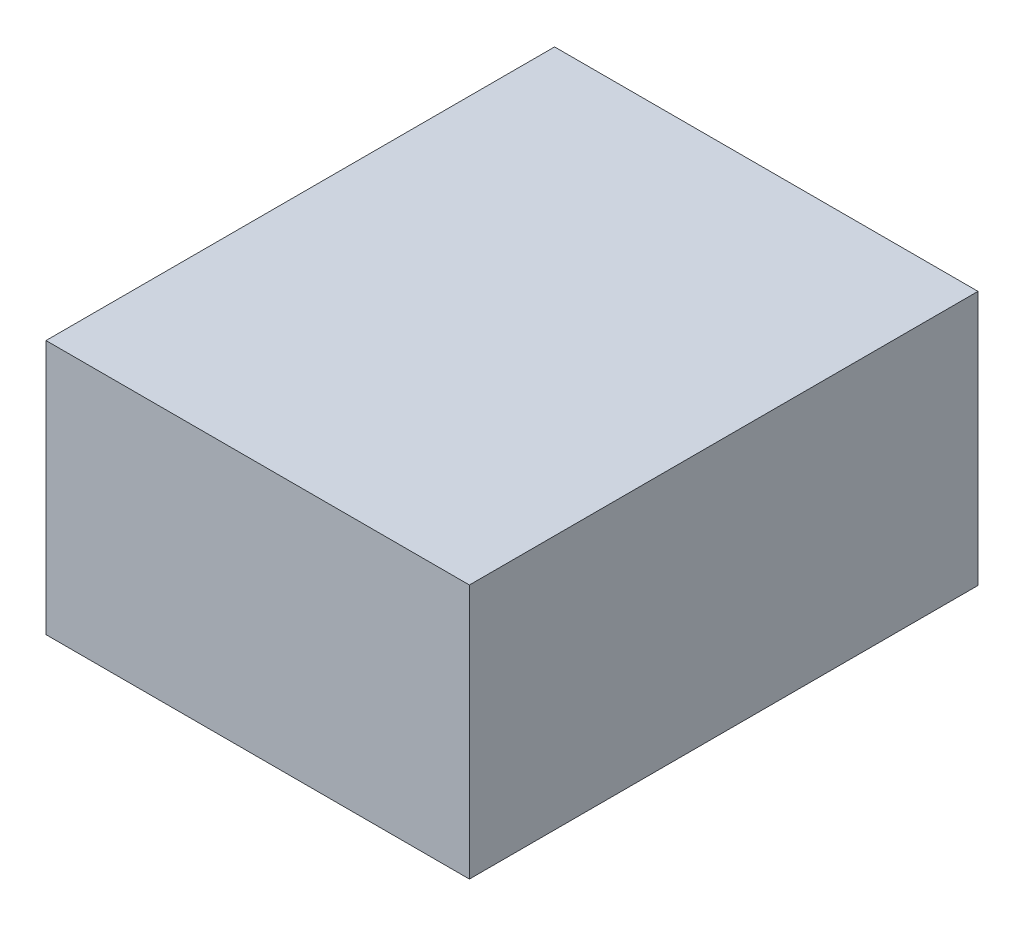
ISO-10303-21;
HEADER;
FILE_DESCRIPTION(('STEP AP214'),'2;1');
FILE_NAME('part.step','',(''),(''),'','','');
FILE_SCHEMA(('AUTOMOTIVE_DESIGN { 1 0 10303 214 1 1 1 1 }'));
ENDSEC;
DATA;
#1=APPLICATION_CONTEXT('core data for automotive mechanical design processes');
#2=APPLICATION_PROTOCOL_DEFINITION('international standard','automotive_design',2000,#1);
#3=PRODUCT_CONTEXT('',#1,'mechanical');
#4=PRODUCT('Part','Part','',(#3));
#5=PRODUCT_RELATED_PRODUCT_CATEGORY('part','',(#4));
#6=PRODUCT_DEFINITION_FORMATION('','',#4);
#7=PRODUCT_DEFINITION_CONTEXT('part definition',#1,'design');
#8=PRODUCT_DEFINITION('design','',#6,#7);
#9=PRODUCT_DEFINITION_SHAPE('','',#8);
#10=(LENGTH_UNIT() NAMED_UNIT(*) SI_UNIT(.MILLI.,.METRE.));
#11=(NAMED_UNIT(*) PLANE_ANGLE_UNIT() SI_UNIT($,.RADIAN.));
#12=(NAMED_UNIT(*) SI_UNIT($,.STERADIAN.) SOLID_ANGLE_UNIT());
#13=UNCERTAINTY_MEASURE_WITH_UNIT(LENGTH_MEASURE(1.E-05),#10,'distance_accuracy_value','');
#14=(GEOMETRIC_REPRESENTATION_CONTEXT(3) GLOBAL_UNCERTAINTY_ASSIGNED_CONTEXT((#13)) GLOBAL_UNIT_ASSIGNED_CONTEXT((#10,
#11,#12)) REPRESENTATION_CONTEXT('',''));
#15=CARTESIAN_POINT('',(0.,0.,0.));
#16=DIRECTION('',(0.,0.,1.));
#17=DIRECTION('',(1.,0.,0.));
#18=AXIS2_PLACEMENT_3D('',#15,#16,#17);
#19=CARTESIAN_POINT('',(12.48749852,7.51249958,0.));
#20=DIRECTION('',(0.,-1.,0.));
#21=DIRECTION('',(0.,0.,-1.));
#22=AXIS2_PLACEMENT_3D('',#19,#20,#21);
#23=PLANE('',#22);
#24=DIRECTION('',(0.,0.,-1.));
#25=VECTOR('',#24,1.);
#26=CARTESIAN_POINT('',(-12.48750106,7.51249958,0.));
#27=LINE('',#26,#25);
#28=CARTESIAN_POINT('',(-12.48750106,7.51249958,0.));
#29=VERTEX_POINT('',#28);
#30=CARTESIAN_POINT('',(-12.48750106,7.51249958,30.00000096));
#31=VERTEX_POINT('',#30);
#32=EDGE_CURVE('E19',#29,#31,#27,.F.);
#33=ORIENTED_EDGE('',*,*,#32,.T.);
#34=DIRECTION('',(-1.,0.,0.));
#35=VECTOR('',#34,1.);
#36=CARTESIAN_POINT('',(-12.48750106,7.51249958,30.00000096));
#37=LINE('',#36,#35);
#38=CARTESIAN_POINT('',(12.48749852,7.51249958,30.00000096));
#39=VERTEX_POINT('',#38);
#40=EDGE_CURVE('E54',#31,#39,#37,.F.);
#41=ORIENTED_EDGE('',*,*,#40,.T.);
#42=DIRECTION('',(0.,0.,1.));
#43=VECTOR('',#42,1.);
#44=CARTESIAN_POINT('',(12.48749852,7.51249958,0.));
#45=LINE('',#44,#43);
#46=CARTESIAN_POINT('',(12.48749852,7.51249958,0.));
#47=VERTEX_POINT('',#46);
#48=EDGE_CURVE('E75',#39,#47,#45,.F.);
#49=ORIENTED_EDGE('',*,*,#48,.T.);
#50=DIRECTION('',(-1.,0.,0.));
#51=VECTOR('',#50,1.);
#52=CARTESIAN_POINT('',(-12.48750106,7.51249958,0.));
#53=LINE('',#52,#51);
#54=EDGE_CURVE('E57',#29,#47,#53,.F.);
#55=ORIENTED_EDGE('',*,*,#54,.F.);
#56=EDGE_LOOP('',(#33,#41,#49,#55));
#57=FACE_BOUND('',#56,.T.);
#58=ADVANCED_FACE('F16',(#57),#23,.F.);
#59=CARTESIAN_POINT('',(-12.48750106,7.51249958,0.));
#60=DIRECTION('',(1.,0.,0.));
#61=DIRECTION('',(0.,0.,-1.));
#62=AXIS2_PLACEMENT_3D('',#59,#60,#61);
#63=PLANE('',#62);
#64=DIRECTION('',(0.,0.,1.));
#65=VECTOR('',#64,1.);
#66=CARTESIAN_POINT('',(-12.48750106,-7.51249958,0.));
#67=LINE('',#66,#65);
#68=CARTESIAN_POINT('',(-12.48750106,-7.51249958,0.));
#69=VERTEX_POINT('',#68);
#70=CARTESIAN_POINT('',(-12.48750106,-7.51249958,30.00000096));
#71=VERTEX_POINT('',#70);
#72=EDGE_CURVE('E72',#69,#71,#67,.T.);
#73=ORIENTED_EDGE('',*,*,#72,.T.);
#74=DIRECTION('',(0.,1.,0.));
#75=VECTOR('',#74,1.);
#76=CARTESIAN_POINT('',(-12.48750106,-7.51249958,30.00000096));
#77=LINE('',#76,#75);
#78=EDGE_CURVE('E62',#71,#31,#77,.T.);
#79=ORIENTED_EDGE('',*,*,#78,.T.);
#80=ORIENTED_EDGE('',*,*,#32,.F.);
#81=DIRECTION('',(0.,1.,0.));
#82=VECTOR('',#81,1.);
#83=CARTESIAN_POINT('',(-12.48750106,-7.51249958,0.));
#84=LINE('',#83,#82);
#85=EDGE_CURVE('E77',#69,#29,#84,.T.);
#86=ORIENTED_EDGE('',*,*,#85,.F.);
#87=EDGE_LOOP('',(#73,#79,#80,#86));
#88=FACE_BOUND('',#87,.T.);
#89=ADVANCED_FACE('F71',(#88),#63,.F.);
#90=CARTESIAN_POINT('',(-12.48750106,-7.51249958,30.00000096));
#91=DIRECTION('',(0.,0.,-1.));
#92=DIRECTION('',(-1.,0.,0.));
#93=AXIS2_PLACEMENT_3D('',#90,#91,#92);
#94=PLANE('',#93);
#95=DIRECTION('',(0.,1.,0.));
#96=VECTOR('',#95,1.);
#97=CARTESIAN_POINT('',(12.48749852,-7.51249958,30.00000096));
#98=LINE('',#97,#96);
#99=CARTESIAN_POINT('',(12.48749852,-7.51249958,30.00000096));
#100=VERTEX_POINT('',#99);
#101=EDGE_CURVE('E68',#100,#39,#98,.T.);
#102=ORIENTED_EDGE('',*,*,#101,.T.);
#103=ORIENTED_EDGE('',*,*,#40,.F.);
#104=ORIENTED_EDGE('',*,*,#78,.F.);
#105=DIRECTION('',(1.,0.,0.));
#106=VECTOR('',#105,1.);
#107=CARTESIAN_POINT('',(-12.48750106,-7.51249958,30.00000096));
#108=LINE('',#107,#106);
#109=EDGE_CURVE('E82',#71,#100,#108,.T.);
#110=ORIENTED_EDGE('',*,*,#109,.T.);
#111=EDGE_LOOP('',(#102,#103,#104,#110));
#112=FACE_BOUND('',#111,.T.);
#113=ADVANCED_FACE('F65',(#112),#94,.F.);
#114=CARTESIAN_POINT('',(12.48749852,-7.51249958,0.));
#115=DIRECTION('',(-1.,0.,0.));
#116=DIRECTION('',(0.,0.,1.));
#117=AXIS2_PLACEMENT_3D('',#114,#115,#116);
#118=PLANE('',#117);
#119=ORIENTED_EDGE('',*,*,#48,.F.);
#120=ORIENTED_EDGE('',*,*,#101,.F.);
#121=DIRECTION('',(0.,0.,1.));
#122=VECTOR('',#121,1.);
#123=CARTESIAN_POINT('',(12.48749852,-7.51249958,0.));
#124=LINE('',#123,#122);
#125=CARTESIAN_POINT('',(12.48749852,-7.51249958,0.));
#126=VERTEX_POINT('',#125);
#127=EDGE_CURVE('E25',#100,#126,#124,.F.);
#128=ORIENTED_EDGE('',*,*,#127,.T.);
#129=DIRECTION('',(0.,1.,0.));
#130=VECTOR('',#129,1.);
#131=CARTESIAN_POINT('',(12.48749852,-7.51249958,0.));
#132=LINE('',#131,#130);
#133=EDGE_CURVE('E33',#47,#126,#132,.F.);
#134=ORIENTED_EDGE('',*,*,#133,.F.);
#135=EDGE_LOOP('',(#119,#120,#128,#134));
#136=FACE_BOUND('',#135,.T.);
#137=ADVANCED_FACE('F87',(#136),#118,.F.);
#138=CARTESIAN_POINT('',(-12.48750106,-7.51249958,0.));
#139=DIRECTION('',(0.,0.,-1.));
#140=DIRECTION('',(-1.,0.,0.));
#141=AXIS2_PLACEMENT_3D('',#138,#139,#140);
#142=PLANE('',#141);
#143=ORIENTED_EDGE('',*,*,#133,.T.);
#144=DIRECTION('',(1.,0.,0.));
#145=VECTOR('',#144,1.);
#146=CARTESIAN_POINT('',(-12.48750106,-7.51249958,0.));
#147=LINE('',#146,#145);
#148=EDGE_CURVE('E10',#126,#69,#147,.F.);
#149=ORIENTED_EDGE('',*,*,#148,.T.);
#150=ORIENTED_EDGE('',*,*,#85,.T.);
#151=ORIENTED_EDGE('',*,*,#54,.T.);
#152=EDGE_LOOP('',(#143,#149,#150,#151));
#153=FACE_BOUND('',#152,.T.);
#154=ADVANCED_FACE('F90',(#153),#142,.T.);
#155=CARTESIAN_POINT('',(-12.48750106,-7.51249958,0.));
#156=DIRECTION('',(0.,1.,0.));
#157=DIRECTION('',(0.,0.,1.));
#158=AXIS2_PLACEMENT_3D('',#155,#156,#157);
#159=PLANE('',#158);
#160=ORIENTED_EDGE('',*,*,#127,.F.);
#161=ORIENTED_EDGE('',*,*,#109,.F.);
#162=ORIENTED_EDGE('',*,*,#72,.F.);
#163=ORIENTED_EDGE('',*,*,#148,.F.);
#164=EDGE_LOOP('',(#160,#161,#162,#163));
#165=FACE_BOUND('',#164,.T.);
#166=ADVANCED_FACE('F89',(#165),#159,.F.);
#167=CLOSED_SHELL('',(#58,#89,#113,#137,#154,#166));
#168=MANIFOLD_SOLID_BREP('B1',#167);
#169=ADVANCED_BREP_SHAPE_REPRESENTATION('',(#18,#168),#14);
#170=SHAPE_DEFINITION_REPRESENTATION(#9,#169);
ENDSEC;
END-ISO-10303-21;
